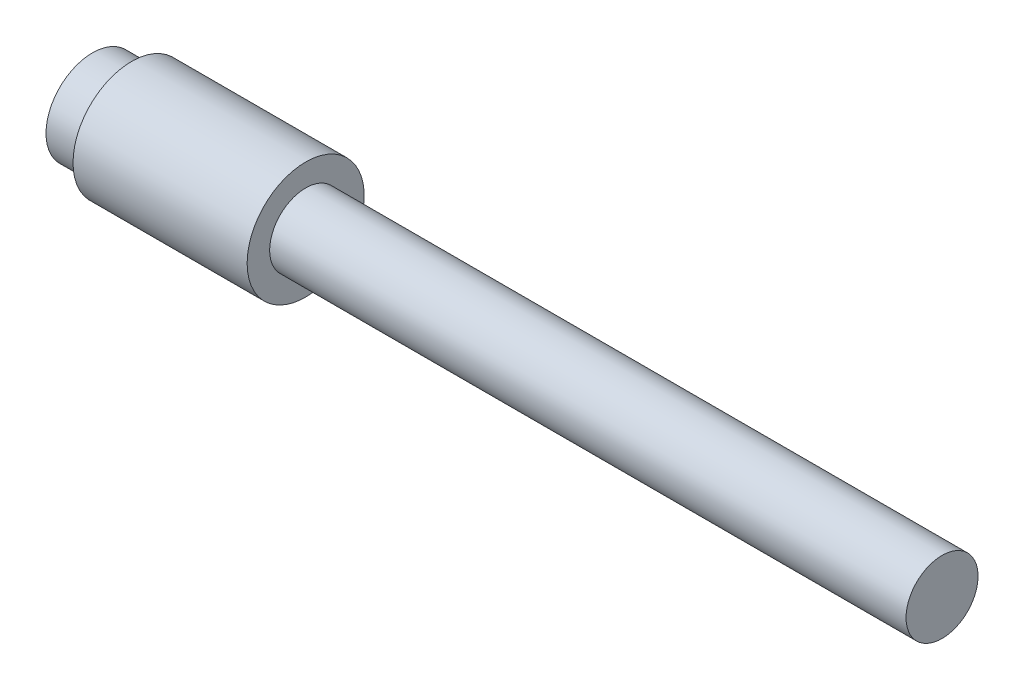
ISO-10303-21;
HEADER;
FILE_DESCRIPTION(('STEP AP214'),'2;1');
FILE_NAME('part.step','',(''),(''),'','','');
FILE_SCHEMA(('AUTOMOTIVE_DESIGN { 1 0 10303 214 1 1 1 1 }'));
ENDSEC;
DATA;
#1=APPLICATION_CONTEXT('core data for automotive mechanical design processes');
#2=APPLICATION_PROTOCOL_DEFINITION('international standard','automotive_design',2000,#1);
#3=PRODUCT_CONTEXT('',#1,'mechanical');
#4=PRODUCT('Part','Part','',(#3));
#5=PRODUCT_RELATED_PRODUCT_CATEGORY('part','',(#4));
#6=PRODUCT_DEFINITION_FORMATION('','',#4);
#7=PRODUCT_DEFINITION_CONTEXT('part definition',#1,'design');
#8=PRODUCT_DEFINITION('design','',#6,#7);
#9=PRODUCT_DEFINITION_SHAPE('','',#8);
#10=(LENGTH_UNIT() NAMED_UNIT(*) SI_UNIT(.MILLI.,.METRE.));
#11=(NAMED_UNIT(*) PLANE_ANGLE_UNIT() SI_UNIT($,.RADIAN.));
#12=(NAMED_UNIT(*) SI_UNIT($,.STERADIAN.) SOLID_ANGLE_UNIT());
#13=UNCERTAINTY_MEASURE_WITH_UNIT(LENGTH_MEASURE(1.E-05),#10,'distance_accuracy_value','');
#14=(GEOMETRIC_REPRESENTATION_CONTEXT(3) GLOBAL_UNCERTAINTY_ASSIGNED_CONTEXT((#13)) GLOBAL_UNIT_ASSIGNED_CONTEXT((#10,
#11,#12)) REPRESENTATION_CONTEXT('',''));
#15=CARTESIAN_POINT('',(0.,0.,0.));
#16=DIRECTION('',(0.,0.,1.));
#17=DIRECTION('',(1.,0.,0.));
#18=AXIS2_PLACEMENT_3D('',#15,#16,#17);
#19=CARTESIAN_POINT('',(0.,0.,0.));
#20=DIRECTION('',(1.,0.,0.));
#21=DIRECTION('',(0.,0.,-0.999999999999999));
#22=AXIS2_PLACEMENT_3D('',#19,#20,#21);
#23=PLANE('',#22);
#24=CARTESIAN_POINT('',(0.,0.,0.));
#25=DIRECTION('',(-1.,0.,0.));
#26=DIRECTION('',(0.,0.,0.999999999999999));
#27=AXIS2_PLACEMENT_3D('',#24,#25,#26);
#28=CIRCLE('',#27,7.75);
#29=CARTESIAN_POINT('',(0.,0.,7.75));
#30=VERTEX_POINT('',#29);
#31=EDGE_CURVE('E12',#30,#30,#28,.T.);
#32=ORIENTED_EDGE('',*,*,#31,.T.);
#33=EDGE_LOOP('',(#32));
#34=FACE_BOUND('',#33,.T.);
#35=ADVANCED_FACE('F44',(#34),#23,.F.);
#36=CARTESIAN_POINT('',(0.,0.,0.));
#37=DIRECTION('',(-1.,0.,0.));
#38=DIRECTION('',(0.,0.,0.999999999999999));
#39=AXIS2_PLACEMENT_3D('',#36,#37,#38);
#40=CYLINDRICAL_SURFACE('',#39,7.75);
#41=ORIENTED_EDGE('',*,*,#31,.F.);
#42=EDGE_LOOP('',(#41));
#43=FACE_BOUND('',#42,.T.);
#44=CARTESIAN_POINT('',(6.50000000000001,0.,0.));
#45=DIRECTION('',(-1.,0.,0.));
#46=DIRECTION('',(0.,0.,0.999999999999999));
#47=AXIS2_PLACEMENT_3D('',#44,#45,#46);
#48=CIRCLE('',#47,7.75);
#49=CARTESIAN_POINT('',(6.50000000000001,0.,7.75));
#50=VERTEX_POINT('',#49);
#51=EDGE_CURVE('E51',#50,#50,#48,.T.);
#52=ORIENTED_EDGE('',*,*,#51,.T.);
#53=EDGE_LOOP('',(#52));
#54=FACE_BOUND('',#53,.T.);
#55=ADVANCED_FACE('F91',(#43,#54),#40,.T.);
#56=CARTESIAN_POINT('',(6.50000000000001,7.75,0.));
#57=DIRECTION('',(1.,0.,0.));
#58=DIRECTION('',(0.,0.,-0.999999999999999));
#59=AXIS2_PLACEMENT_3D('',#56,#57,#58);
#60=PLANE('',#59);
#61=ORIENTED_EDGE('',*,*,#51,.F.);
#62=EDGE_LOOP('',(#61));
#63=FACE_BOUND('',#62,.T.);
#64=CARTESIAN_POINT('',(6.50000000000001,0.,0.));
#65=DIRECTION('',(-1.,0.,0.));
#66=DIRECTION('',(0.,0.,0.999999999999999));
#67=AXIS2_PLACEMENT_3D('',#64,#65,#66);
#68=CIRCLE('',#67,9.75);
#69=CARTESIAN_POINT('',(6.50000000000001,0.,9.75));
#70=VERTEX_POINT('',#69);
#71=EDGE_CURVE('E57',#70,#70,#68,.T.);
#72=ORIENTED_EDGE('',*,*,#71,.T.);
#73=EDGE_LOOP('',(#72));
#74=FACE_BOUND('',#73,.T.);
#75=ADVANCED_FACE('F95',(#63,#74),#60,.F.);
#76=CARTESIAN_POINT('',(0.,0.,0.));
#77=DIRECTION('',(-1.,0.,0.));
#78=DIRECTION('',(0.,0.,0.999999999999999));
#79=AXIS2_PLACEMENT_3D('',#76,#77,#78);
#80=CYLINDRICAL_SURFACE('',#79,9.75);
#81=ORIENTED_EDGE('',*,*,#71,.F.);
#82=EDGE_LOOP('',(#81));
#83=FACE_BOUND('',#82,.T.);
#84=CARTESIAN_POINT('',(35.5,0.,0.));
#85=DIRECTION('',(-1.,0.,0.));
#86=DIRECTION('',(0.,0.,0.999999999999999));
#87=AXIS2_PLACEMENT_3D('',#84,#85,#86);
#88=CIRCLE('',#87,9.75);
#89=CARTESIAN_POINT('',(35.5,0.,9.74999999999999));
#90=VERTEX_POINT('',#89);
#91=EDGE_CURVE('E63',#90,#90,#88,.T.);
#92=ORIENTED_EDGE('',*,*,#91,.T.);
#93=EDGE_LOOP('',(#92));
#94=FACE_BOUND('',#93,.T.);
#95=ADVANCED_FACE('F100',(#83,#94),#80,.T.);
#96=CARTESIAN_POINT('',(35.5,9.74999999999998,0.));
#97=DIRECTION('',(-1.,0.,0.));
#98=DIRECTION('',(0.,0.,0.999999999999999));
#99=AXIS2_PLACEMENT_3D('',#96,#97,#98);
#100=PLANE('',#99);
#101=ORIENTED_EDGE('',*,*,#91,.F.);
#102=EDGE_LOOP('',(#101));
#103=FACE_BOUND('',#102,.T.);
#104=CARTESIAN_POINT('',(35.5,0.,0.));
#105=DIRECTION('',(-1.,0.,0.));
#106=DIRECTION('',(0.,0.,0.999999999999999));
#107=AXIS2_PLACEMENT_3D('',#104,#105,#106);
#108=CIRCLE('',#107,6.);
#109=CARTESIAN_POINT('',(35.5,0.,6.));
#110=VERTEX_POINT('',#109);
#111=EDGE_CURVE('E69',#110,#110,#108,.T.);
#112=ORIENTED_EDGE('',*,*,#111,.T.);
#113=EDGE_LOOP('',(#112));
#114=FACE_BOUND('',#113,.T.);
#115=ADVANCED_FACE('F87',(#103,#114),#100,.F.);
#116=CARTESIAN_POINT('',(0.,0.,0.));
#117=DIRECTION('',(-1.,0.,0.));
#118=DIRECTION('',(0.,0.,0.999999999999999));
#119=AXIS2_PLACEMENT_3D('',#116,#117,#118);
#120=CYLINDRICAL_SURFACE('',#119,6.);
#121=ORIENTED_EDGE('',*,*,#111,.F.);
#122=EDGE_LOOP('',(#121));
#123=FACE_BOUND('',#122,.T.);
#124=CARTESIAN_POINT('',(141.5,0.,0.));
#125=DIRECTION('',(-1.,0.,0.));
#126=DIRECTION('',(0.,0.,0.999999999999999));
#127=AXIS2_PLACEMENT_3D('',#124,#125,#126);
#128=CIRCLE('',#127,6.);
#129=CARTESIAN_POINT('',(141.5,0.,6.));
#130=VERTEX_POINT('',#129);
#131=EDGE_CURVE('E73',#130,#130,#128,.T.);
#132=ORIENTED_EDGE('',*,*,#131,.T.);
#133=EDGE_LOOP('',(#132));
#134=FACE_BOUND('',#133,.T.);
#135=ADVANCED_FACE('F79',(#123,#134),#120,.T.);
#136=CARTESIAN_POINT('',(141.5,6.,0.));
#137=DIRECTION('',(-1.,0.,0.));
#138=DIRECTION('',(0.,0.,0.999999999999999));
#139=AXIS2_PLACEMENT_3D('',#136,#137,#138);
#140=PLANE('',#139);
#141=ORIENTED_EDGE('',*,*,#131,.F.);
#142=EDGE_LOOP('',(#141));
#143=FACE_BOUND('',#142,.T.);
#144=ADVANCED_FACE('F81',(#143),#140,.F.);
#145=CLOSED_SHELL('',(#35,#55,#75,#95,#115,#135,#144));
#146=MANIFOLD_SOLID_BREP('B2',#145);
#147=ADVANCED_BREP_SHAPE_REPRESENTATION('',(#18,#146),#14);
#148=SHAPE_DEFINITION_REPRESENTATION(#9,#147);
ENDSEC;
END-ISO-10303-21;
